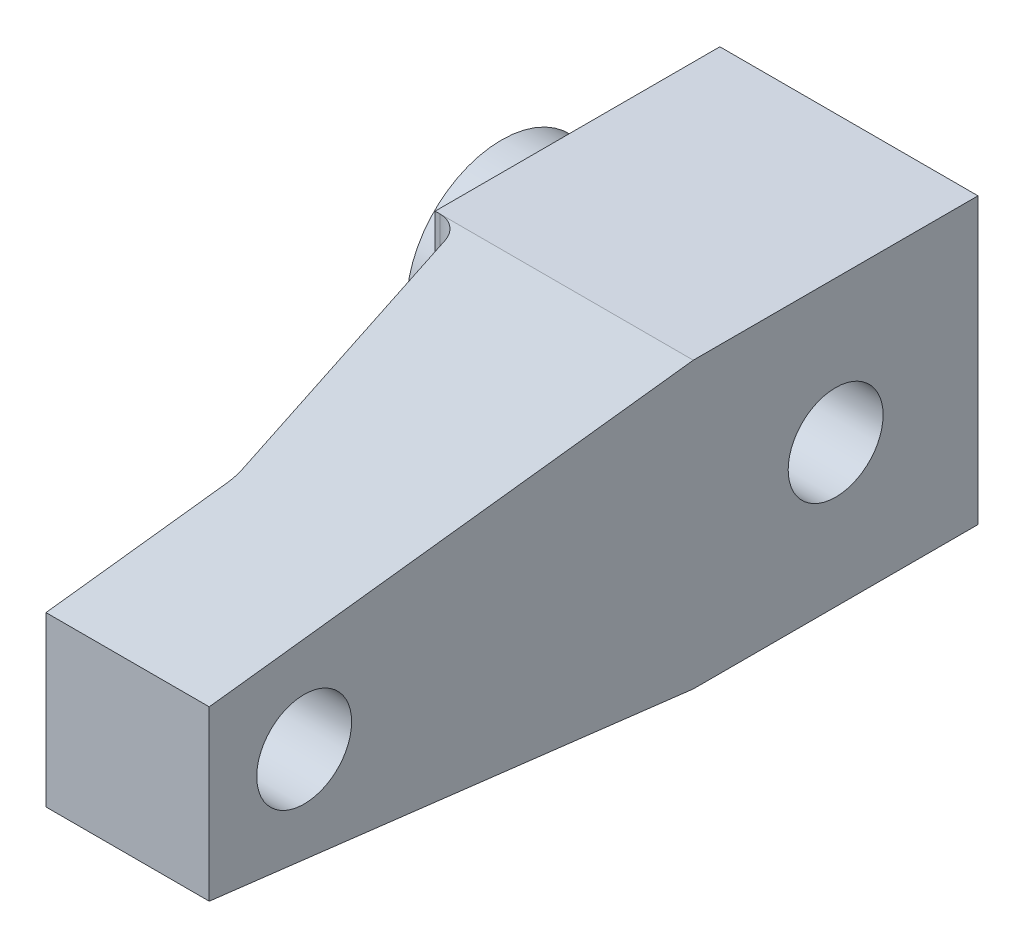
ISO-10303-21;
HEADER;
FILE_DESCRIPTION(('STEP AP214'),'2;1');
FILE_NAME('part.step','',(''),(''),'','','');
FILE_SCHEMA(('AUTOMOTIVE_DESIGN { 1 0 10303 214 1 1 1 1 }'));
ENDSEC;
DATA;
#1=APPLICATION_CONTEXT('core data for automotive mechanical design processes');
#2=APPLICATION_PROTOCOL_DEFINITION('international standard','automotive_design',2000,#1);
#3=PRODUCT_CONTEXT('',#1,'mechanical');
#4=PRODUCT('Part','Part','',(#3));
#5=PRODUCT_RELATED_PRODUCT_CATEGORY('part','',(#4));
#6=PRODUCT_DEFINITION_FORMATION('','',#4);
#7=PRODUCT_DEFINITION_CONTEXT('part definition',#1,'design');
#8=PRODUCT_DEFINITION('design','',#6,#7);
#9=PRODUCT_DEFINITION_SHAPE('','',#8);
#10=(LENGTH_UNIT() NAMED_UNIT(*) SI_UNIT(.MILLI.,.METRE.));
#11=(NAMED_UNIT(*) PLANE_ANGLE_UNIT() SI_UNIT($,.RADIAN.));
#12=(NAMED_UNIT(*) SI_UNIT($,.STERADIAN.) SOLID_ANGLE_UNIT());
#13=UNCERTAINTY_MEASURE_WITH_UNIT(LENGTH_MEASURE(1.E-05),#10,'distance_accuracy_value','');
#14=(GEOMETRIC_REPRESENTATION_CONTEXT(3) GLOBAL_UNCERTAINTY_ASSIGNED_CONTEXT((#13)) GLOBAL_UNIT_ASSIGNED_CONTEXT((#10,
#11,#12)) REPRESENTATION_CONTEXT('',''));
#15=CARTESIAN_POINT('',(0.,0.,0.));
#16=DIRECTION('',(0.,0.,1.));
#17=DIRECTION('',(1.,0.,0.));
#18=AXIS2_PLACEMENT_3D('',#15,#16,#17);
#19=CARTESIAN_POINT('',(0.,0.,0.));
#20=DIRECTION('',(-1.,0.,0.));
#21=DIRECTION('',(0.,0.,1.));
#22=AXIS2_PLACEMENT_3D('',#19,#20,#21);
#23=PLANE('',#22);
#24=DIRECTION('',(0.,1.,0.));
#25=VECTOR('',#24,1.);
#26=CARTESIAN_POINT('',(0.,-4.7625,4.7625));
#27=LINE('',#26,#25);
#28=CARTESIAN_POINT('',(0.,-4.7625,4.7625));
#29=VERTEX_POINT('',#28);
#30=CARTESIAN_POINT('',(0.,4.7625,4.7625));
#31=VERTEX_POINT('',#30);
#32=EDGE_CURVE('E170',#29,#31,#27,.T.);
#33=ORIENTED_EDGE('',*,*,#32,.T.);
#34=DIRECTION('',(0.,0.,1.));
#35=VECTOR('',#34,1.);
#36=CARTESIAN_POINT('',(0.,4.7625,-4.7625));
#37=LINE('',#36,#35);
#38=CARTESIAN_POINT('',(0.,4.7625,-4.7625));
#39=VERTEX_POINT('',#38);
#40=EDGE_CURVE('E119',#39,#31,#37,.T.);
#41=ORIENTED_EDGE('',*,*,#40,.F.);
#42=DIRECTION('',(0.,1.,0.));
#43=VECTOR('',#42,1.);
#44=CARTESIAN_POINT('',(0.,4.7625,-4.7625));
#45=LINE('',#44,#43);
#46=CARTESIAN_POINT('',(0.,-4.7625,-4.7625));
#47=VERTEX_POINT('',#46);
#48=EDGE_CURVE('E73',#47,#39,#45,.T.);
#49=ORIENTED_EDGE('',*,*,#48,.F.);
#50=DIRECTION('',(0.,0.,-1.));
#51=VECTOR('',#50,1.);
#52=CARTESIAN_POINT('',(0.,-4.7625,-4.7625));
#53=LINE('',#52,#51);
#54=EDGE_CURVE('E67',#29,#47,#53,.T.);
#55=ORIENTED_EDGE('',*,*,#54,.F.);
#56=EDGE_LOOP('',(#33,#41,#49,#55));
#57=FACE_BOUND('',#56,.T.);
#58=CARTESIAN_POINT('',(0.,0.,0.));
#59=DIRECTION('',(-1.,0.,0.));
#60=DIRECTION('',(0.,0.,1.));
#61=AXIS2_PLACEMENT_3D('',#58,#59,#60);
#62=CIRCLE('',#61,3.175);
#63=CARTESIAN_POINT('',(0.,0.,3.175));
#64=VERTEX_POINT('',#63);
#65=EDGE_CURVE('E230',#64,#64,#62,.T.);
#66=ORIENTED_EDGE('',*,*,#65,.F.);
#67=EDGE_LOOP('',(#66));
#68=FACE_BOUND('',#67,.T.);
#69=ADVANCED_FACE('F35',(#57,#68),#23,.T.);
#70=CARTESIAN_POINT('',(8.636,0.,0.));
#71=DIRECTION('',(-1.,0.,0.));
#72=DIRECTION('',(0.,0.,1.));
#73=AXIS2_PLACEMENT_3D('',#70,#71,#72);
#74=PLANE('',#73);
#75=DIRECTION('',(0.,0.,1.));
#76=VECTOR('',#75,1.);
#77=CARTESIAN_POINT('',(8.636,4.7625,-4.7625));
#78=LINE('',#77,#76);
#79=CARTESIAN_POINT('',(8.636,4.7625,-4.7625));
#80=VERTEX_POINT('',#79);
#81=CARTESIAN_POINT('',(8.636,4.7625,4.7625));
#82=VERTEX_POINT('',#81);
#83=EDGE_CURVE('E125',#80,#82,#78,.T.);
#84=ORIENTED_EDGE('',*,*,#83,.T.);
#85=DIRECTION('',(0.,-0.119336768534246,0.992853833993606));
#86=VECTOR('',#85,1.);
#87=CARTESIAN_POINT('',(8.636,4.7625,4.7625));
#88=LINE('',#87,#86);
#89=CARTESIAN_POINT('',(8.636,2.81623101424391,20.955));
#90=VERTEX_POINT('',#89);
#91=EDGE_CURVE('E82',#82,#90,#88,.T.);
#92=ORIENTED_EDGE('',*,*,#91,.T.);
#93=DIRECTION('',(0.,-1.,0.));
#94=VECTOR('',#93,1.);
#95=CARTESIAN_POINT('',(8.636,-2.81623101424391,20.955));
#96=LINE('',#95,#94);
#97=CARTESIAN_POINT('',(8.636,-2.81623101424391,20.955));
#98=VERTEX_POINT('',#97);
#99=EDGE_CURVE('E98',#90,#98,#96,.T.);
#100=ORIENTED_EDGE('',*,*,#99,.T.);
#101=DIRECTION('',(0.,-0.119336768534246,-0.992853833993606));
#102=VECTOR('',#101,1.);
#103=CARTESIAN_POINT('',(8.636,-4.7625,4.7625));
#104=LINE('',#103,#102);
#105=CARTESIAN_POINT('',(8.636,-4.7625,4.7625));
#106=VERTEX_POINT('',#105);
#107=EDGE_CURVE('E91',#98,#106,#104,.T.);
#108=ORIENTED_EDGE('',*,*,#107,.T.);
#109=DIRECTION('',(0.,0.,-1.));
#110=VECTOR('',#109,1.);
#111=CARTESIAN_POINT('',(8.636,-4.7625,-4.7625));
#112=LINE('',#111,#110);
#113=CARTESIAN_POINT('',(8.636,-4.7625,-4.7625));
#114=VERTEX_POINT('',#113);
#115=EDGE_CURVE('E96',#106,#114,#112,.T.);
#116=ORIENTED_EDGE('',*,*,#115,.T.);
#117=DIRECTION('',(0.,1.,0.));
#118=VECTOR('',#117,1.);
#119=CARTESIAN_POINT('',(8.636,4.7625,-4.7625));
#120=LINE('',#119,#118);
#121=EDGE_CURVE('E52',#114,#80,#120,.T.);
#122=ORIENTED_EDGE('',*,*,#121,.T.);
#123=EDGE_LOOP('',(#84,#92,#100,#108,#116,#122));
#124=FACE_BOUND('',#123,.T.);
#125=CARTESIAN_POINT('',(8.636,0.,0.));
#126=DIRECTION('',(1.,0.,0.));
#127=DIRECTION('',(0.,0.,-1.));
#128=AXIS2_PLACEMENT_3D('',#125,#126,#127);
#129=CIRCLE('',#128,1.5875);
#130=CARTESIAN_POINT('',(8.636,0.,-1.5875));
#131=VERTEX_POINT('',#130);
#132=EDGE_CURVE('E122',#131,#131,#129,.T.);
#133=ORIENTED_EDGE('',*,*,#132,.F.);
#134=EDGE_LOOP('',(#133));
#135=FACE_BOUND('',#134,.T.);
#136=CARTESIAN_POINT('',(8.636,0.,17.78));
#137=DIRECTION('',(1.,0.,0.));
#138=DIRECTION('',(0.,0.,-1.));
#139=AXIS2_PLACEMENT_3D('',#136,#137,#138);
#140=CIRCLE('',#139,1.5875);
#141=CARTESIAN_POINT('',(8.636,0.,16.1925));
#142=VERTEX_POINT('',#141);
#143=EDGE_CURVE('E191',#142,#142,#140,.T.);
#144=ORIENTED_EDGE('',*,*,#143,.F.);
#145=EDGE_LOOP('',(#144));
#146=FACE_BOUND('',#145,.T.);
#147=ADVANCED_FACE('F93',(#124,#135,#146),#74,.F.);
#148=CARTESIAN_POINT('',(8.636,4.7625,-4.7625));
#149=DIRECTION('',(0.,-1.,0.));
#150=DIRECTION('',(0.,0.,-1.));
#151=AXIS2_PLACEMENT_3D('',#148,#149,#150);
#152=PLANE('',#151);
#153=ORIENTED_EDGE('',*,*,#40,.T.);
#154=DIRECTION('',(-1.,0.,0.));
#155=VECTOR('',#154,1.);
#156=CARTESIAN_POINT('',(0.,4.7625,4.7625));
#157=LINE('',#156,#155);
#158=CARTESIAN_POINT('',(0.169136426977912,4.7625,4.7625));
#159=VERTEX_POINT('',#158);
#160=EDGE_CURVE('E223',#159,#31,#157,.T.);
#161=ORIENTED_EDGE('',*,*,#160,.F.);
#162=DIRECTION('',(-1.,0.,0.));
#163=VECTOR('',#162,1.);
#164=CARTESIAN_POINT('',(8.636,4.7625,4.7625));
#165=LINE('',#164,#163);
#166=EDGE_CURVE('E132',#82,#159,#165,.T.);
#167=ORIENTED_EDGE('',*,*,#166,.F.);
#168=ORIENTED_EDGE('',*,*,#83,.F.);
#169=DIRECTION('',(-1.,0.,0.));
#170=VECTOR('',#169,1.);
#171=CARTESIAN_POINT('',(8.636,4.7625,-4.7625));
#172=LINE('',#171,#170);
#173=EDGE_CURVE('E115',#80,#39,#172,.T.);
#174=ORIENTED_EDGE('',*,*,#173,.T.);
#175=EDGE_LOOP('',(#153,#161,#167,#168,#174));
#176=FACE_BOUND('',#175,.T.);
#177=ADVANCED_FACE('F37',(#176),#152,.F.);
#178=CARTESIAN_POINT('',(8.636,4.7625,4.7625));
#179=DIRECTION('',(0.,-0.992853833993606,-0.119336768534246));
#180=DIRECTION('',(0.,0.119336768534246,-0.992853833993606));
#181=AXIS2_PLACEMENT_3D('',#178,#179,#180);
#182=PLANE('',#181);
#183=ORIENTED_EDGE('',*,*,#166,.T.);
#184=CARTESIAN_POINT('',(0.169136426977917,4.66709465756098,5.55625));
#185=DIRECTION('',(0.,-0.992853833993606,-0.119336768534246));
#186=DIRECTION('',(0.,0.119336768534246,-0.992853833993606));
#187=AXIS2_PLACEMENT_3D('',#184,#185,#186);
#188=ELLIPSE('',#187,0.799463096000002,0.79375);
#189=CARTESIAN_POINT('',(0.940628703875654,4.68952934941767,5.36959864268604));
#190=VERTEX_POINT('',#189);
#191=EDGE_CURVE('E183',#159,#190,#188,.T.);
#192=ORIENTED_EDGE('',*,*,#191,.T.);
#193=DIRECTION('',(0.233562867927725,-0.11603611670614,0.965393187434599));
#194=VECTOR('',#193,1.);
#195=CARTESIAN_POINT('',(1.22155738920292,4.54996147201506,6.53077054203874));
#196=LINE('',#195,#194);
#197=CARTESIAN_POINT('',(3.10377528607275,3.61485882712393,14.3106045157674));
#198=VERTEX_POINT('',#197);
#199=EDGE_CURVE('E188',#190,#198,#196,.T.);
#200=ORIENTED_EDGE('',*,*,#199,.T.);
#201=CARTESIAN_POINT('',(0.634999999999999,3.54306781318252,14.9078888591721));
#202=DIRECTION('',(0.,-0.992853833993606,-0.119336768534246));
#203=DIRECTION('',(0.,0.119336768534246,-0.992853833993606));
#204=AXIS2_PLACEMENT_3D('',#201,#202,#203);
#205=ELLIPSE('',#204,2.5582819072,2.54);
#206=CARTESIAN_POINT('',(3.175,3.54306781318252,14.9078888591721));
#207=VERTEX_POINT('',#206);
#208=EDGE_CURVE('E186',#198,#207,#205,.T.);
#209=ORIENTED_EDGE('',*,*,#208,.T.);
#210=DIRECTION('',(0.,-0.119336768534246,0.992853833993606));
#211=VECTOR('',#210,1.);
#212=CARTESIAN_POINT('',(3.175,4.7625,4.7625));
#213=LINE('',#212,#211);
#214=CARTESIAN_POINT('',(3.175,2.81623101424391,20.955));
#215=VERTEX_POINT('',#214);
#216=EDGE_CURVE('E166',#207,#215,#213,.T.);
#217=ORIENTED_EDGE('',*,*,#216,.T.);
#218=DIRECTION('',(-1.,0.,0.));
#219=VECTOR('',#218,1.);
#220=CARTESIAN_POINT('',(8.636,2.81623101424391,20.955));
#221=LINE('',#220,#219);
#222=EDGE_CURVE('E129',#90,#215,#221,.T.);
#223=ORIENTED_EDGE('',*,*,#222,.F.);
#224=ORIENTED_EDGE('',*,*,#91,.F.);
#225=EDGE_LOOP('',(#183,#192,#200,#209,#217,#223,#224));
#226=FACE_BOUND('',#225,.T.);
#227=ADVANCED_FACE('F199',(#226),#182,.F.);
#228=CARTESIAN_POINT('',(8.636,-2.81623101424391,20.955));
#229=DIRECTION('',(0.,0.,-1.));
#230=DIRECTION('',(0.,1.,0.));
#231=AXIS2_PLACEMENT_3D('',#228,#229,#230);
#232=PLANE('',#231);
#233=ORIENTED_EDGE('',*,*,#222,.T.);
#234=DIRECTION('',(0.,1.,0.));
#235=VECTOR('',#234,1.);
#236=CARTESIAN_POINT('',(3.175,-4.7625,20.955));
#237=LINE('',#236,#235);
#238=CARTESIAN_POINT('',(3.175,-2.81623101424391,20.955));
#239=VERTEX_POINT('',#238);
#240=EDGE_CURVE('E167',#239,#215,#237,.T.);
#241=ORIENTED_EDGE('',*,*,#240,.F.);
#242=DIRECTION('',(-1.,0.,0.));
#243=VECTOR('',#242,1.);
#244=CARTESIAN_POINT('',(8.636,-2.81623101424391,20.955));
#245=LINE('',#244,#243);
#246=EDGE_CURVE('E110',#98,#239,#245,.T.);
#247=ORIENTED_EDGE('',*,*,#246,.F.);
#248=ORIENTED_EDGE('',*,*,#99,.F.);
#249=EDGE_LOOP('',(#233,#241,#247,#248));
#250=FACE_BOUND('',#249,.T.);
#251=ADVANCED_FACE('F202',(#250),#232,.F.);
#252=CARTESIAN_POINT('',(8.636,-4.7625,4.7625));
#253=DIRECTION('',(0.,0.992853833993606,-0.119336768534246));
#254=DIRECTION('',(0.,0.119336768534246,0.992853833993606));
#255=AXIS2_PLACEMENT_3D('',#252,#253,#254);
#256=PLANE('',#255);
#257=DIRECTION('',(-0.233562867927725,-0.11603611670614,-0.965393187434599));
#258=VECTOR('',#257,1.);
#259=CARTESIAN_POINT('',(1.22155738920292,-4.54996147201506,6.53077054203874));
#260=LINE('',#259,#258);
#261=CARTESIAN_POINT('',(3.10377528607275,-3.61485882712393,14.3106045157674));
#262=VERTEX_POINT('',#261);
#263=CARTESIAN_POINT('',(0.940628703875654,-4.68952934941767,5.36959864268604));
#264=VERTEX_POINT('',#263);
#265=EDGE_CURVE('E11',#262,#264,#260,.T.);
#266=ORIENTED_EDGE('',*,*,#265,.T.);
#267=CARTESIAN_POINT('',(0.169136426977917,-4.66709465756098,5.55625));
#268=DIRECTION('',(0.,0.992853833993606,-0.119336768534246));
#269=DIRECTION('',(0.,0.119336768534246,0.992853833993606));
#270=AXIS2_PLACEMENT_3D('',#267,#268,#269);
#271=ELLIPSE('',#270,0.799463096000002,0.79375);
#272=CARTESIAN_POINT('',(0.169136426977912,-4.7625,4.7625));
#273=VERTEX_POINT('',#272);
#274=EDGE_CURVE('E109',#264,#273,#271,.T.);
#275=ORIENTED_EDGE('',*,*,#274,.T.);
#276=DIRECTION('',(-1.,0.,0.));
#277=VECTOR('',#276,1.);
#278=CARTESIAN_POINT('',(8.636,-4.7625,4.7625));
#279=LINE('',#278,#277);
#280=EDGE_CURVE('E105',#106,#273,#279,.T.);
#281=ORIENTED_EDGE('',*,*,#280,.F.);
#282=ORIENTED_EDGE('',*,*,#107,.F.);
#283=ORIENTED_EDGE('',*,*,#246,.T.);
#284=DIRECTION('',(0.,-0.119336768534246,-0.992853833993606));
#285=VECTOR('',#284,1.);
#286=CARTESIAN_POINT('',(3.175,-4.7625,4.7625));
#287=LINE('',#286,#285);
#288=CARTESIAN_POINT('',(3.175,-3.54306781318252,14.9078888591721));
#289=VERTEX_POINT('',#288);
#290=EDGE_CURVE('E136',#239,#289,#287,.T.);
#291=ORIENTED_EDGE('',*,*,#290,.T.);
#292=CARTESIAN_POINT('',(0.634999999999999,-3.54306781318252,14.9078888591721));
#293=DIRECTION('',(0.,0.992853833993606,-0.119336768534246));
#294=DIRECTION('',(0.,0.119336768534246,0.992853833993606));
#295=AXIS2_PLACEMENT_3D('',#292,#293,#294);
#296=ELLIPSE('',#295,2.5582819072,2.54);
#297=EDGE_CURVE('E44',#289,#262,#296,.T.);
#298=ORIENTED_EDGE('',*,*,#297,.T.);
#299=EDGE_LOOP('',(#266,#275,#281,#282,#283,#291,#298));
#300=FACE_BOUND('',#299,.T.);
#301=ADVANCED_FACE('F106',(#300),#256,.F.);
#302=CARTESIAN_POINT('',(8.636,-4.7625,-4.7625));
#303=DIRECTION('',(0.,1.,0.));
#304=DIRECTION('',(0.,0.,1.));
#305=AXIS2_PLACEMENT_3D('',#302,#303,#304);
#306=PLANE('',#305);
#307=ORIENTED_EDGE('',*,*,#54,.T.);
#308=DIRECTION('',(-1.,0.,0.));
#309=VECTOR('',#308,1.);
#310=CARTESIAN_POINT('',(8.636,-4.7625,-4.7625));
#311=LINE('',#310,#309);
#312=EDGE_CURVE('E111',#114,#47,#311,.T.);
#313=ORIENTED_EDGE('',*,*,#312,.F.);
#314=ORIENTED_EDGE('',*,*,#115,.F.);
#315=ORIENTED_EDGE('',*,*,#280,.T.);
#316=DIRECTION('',(-1.,0.,0.));
#317=VECTOR('',#316,1.);
#318=CARTESIAN_POINT('',(0.,-4.7625,4.7625));
#319=LINE('',#318,#317);
#320=EDGE_CURVE('E179',#273,#29,#319,.T.);
#321=ORIENTED_EDGE('',*,*,#320,.T.);
#322=EDGE_LOOP('',(#307,#313,#314,#315,#321));
#323=FACE_BOUND('',#322,.T.);
#324=ADVANCED_FACE('F113',(#323),#306,.F.);
#325=CARTESIAN_POINT('',(8.636,4.7625,-4.7625));
#326=DIRECTION('',(0.,0.,1.));
#327=DIRECTION('',(1.,0.,0.));
#328=AXIS2_PLACEMENT_3D('',#325,#326,#327);
#329=PLANE('',#328);
#330=ORIENTED_EDGE('',*,*,#48,.T.);
#331=ORIENTED_EDGE('',*,*,#173,.F.);
#332=ORIENTED_EDGE('',*,*,#121,.F.);
#333=ORIENTED_EDGE('',*,*,#312,.T.);
#334=EDGE_LOOP('',(#330,#331,#332,#333));
#335=FACE_BOUND('',#334,.T.);
#336=ADVANCED_FACE('F264',(#335),#329,.F.);
#337=CARTESIAN_POINT('',(8.636,0.,0.));
#338=DIRECTION('',(-1.,0.,0.));
#339=DIRECTION('',(0.,0.,1.));
#340=AXIS2_PLACEMENT_3D('',#337,#338,#339);
#341=CYLINDRICAL_SURFACE('',#340,1.5875);
#342=ORIENTED_EDGE('',*,*,#132,.T.);
#343=EDGE_LOOP('',(#342));
#344=FACE_BOUND('',#343,.T.);
#345=CARTESIAN_POINT('',(-2.54,0.,0.));
#346=DIRECTION('',(-1.,0.,0.));
#347=DIRECTION('',(0.,0.,1.));
#348=AXIS2_PLACEMENT_3D('',#345,#346,#347);
#349=CIRCLE('',#348,1.5875);
#350=CARTESIAN_POINT('',(-2.54,0.,1.5875));
#351=VERTEX_POINT('',#350);
#352=EDGE_CURVE('E234',#351,#351,#349,.T.);
#353=ORIENTED_EDGE('',*,*,#352,.T.);
#354=EDGE_LOOP('',(#353));
#355=FACE_BOUND('',#354,.T.);
#356=ADVANCED_FACE('F239',(#344,#355),#341,.F.);
#357=CARTESIAN_POINT('',(8.636,0.,17.78));
#358=DIRECTION('',(-1.,0.,0.));
#359=DIRECTION('',(0.,0.,1.));
#360=AXIS2_PLACEMENT_3D('',#357,#358,#359);
#361=CYLINDRICAL_SURFACE('',#360,1.5875);
#362=CARTESIAN_POINT('',(3.175,0.,17.78));
#363=DIRECTION('',(1.,0.,0.));
#364=DIRECTION('',(0.,0.,-1.));
#365=AXIS2_PLACEMENT_3D('',#362,#363,#364);
#366=CIRCLE('',#365,1.5875);
#367=CARTESIAN_POINT('',(3.175,0.,16.1925));
#368=VERTEX_POINT('',#367);
#369=EDGE_CURVE('E134',#368,#368,#366,.T.);
#370=ORIENTED_EDGE('',*,*,#369,.F.);
#371=EDGE_LOOP('',(#370));
#372=FACE_BOUND('',#371,.T.);
#373=ORIENTED_EDGE('',*,*,#143,.T.);
#374=EDGE_LOOP('',(#373));
#375=FACE_BOUND('',#374,.T.);
#376=ADVANCED_FACE('F300',(#372,#375),#361,.F.);
#377=CARTESIAN_POINT('',(0.940628703875654,-4.7625,5.36959864268604));
#378=DIRECTION('',(0.971958774044392,0.,-0.235151316301062));
#379=DIRECTION('',(-0.235151316301062,0.,-0.971958774044392));
#380=AXIS2_PLACEMENT_3D('',#377,#378,#379);
#381=PLANE('',#380);
#382=DIRECTION('',(0.,1.,0.));
#383=VECTOR('',#382,1.);
#384=CARTESIAN_POINT('',(0.940628703875654,-4.7625,5.36959864268604));
#385=LINE('',#384,#383);
#386=EDGE_CURVE('E137',#264,#190,#385,.T.);
#387=ORIENTED_EDGE('',*,*,#386,.F.);
#388=ORIENTED_EDGE('',*,*,#265,.F.);
#389=DIRECTION('',(0.,1.,0.));
#390=VECTOR('',#389,1.);
#391=CARTESIAN_POINT('',(3.10377528607275,-4.7625,14.3106045157674));
#392=LINE('',#391,#390);
#393=EDGE_CURVE('E157',#262,#198,#392,.T.);
#394=ORIENTED_EDGE('',*,*,#393,.T.);
#395=ORIENTED_EDGE('',*,*,#199,.F.);
#396=EDGE_LOOP('',(#387,#388,#394,#395));
#397=FACE_BOUND('',#396,.T.);
#398=ADVANCED_FACE('F212',(#397),#381,.F.);
#399=CARTESIAN_POINT('',(0.634999999999999,-4.7625,14.9078888591721));
#400=DIRECTION('',(0.,1.,0.));
#401=DIRECTION('',(0.,0.,1.));
#402=AXIS2_PLACEMENT_3D('',#399,#400,#401);
#403=CYLINDRICAL_SURFACE('',#402,2.54);
#404=ORIENTED_EDGE('',*,*,#393,.F.);
#405=ORIENTED_EDGE('',*,*,#297,.F.);
#406=DIRECTION('',(0.,1.,0.));
#407=VECTOR('',#406,1.);
#408=CARTESIAN_POINT('',(3.175,-4.7625,14.9078888591721));
#409=LINE('',#408,#407);
#410=EDGE_CURVE('E154',#289,#207,#409,.T.);
#411=ORIENTED_EDGE('',*,*,#410,.T.);
#412=ORIENTED_EDGE('',*,*,#208,.F.);
#413=EDGE_LOOP('',(#404,#405,#411,#412));
#414=FACE_BOUND('',#413,.T.);
#415=ADVANCED_FACE('F151',(#414),#403,.F.);
#416=CARTESIAN_POINT('',(0.169136426977917,-4.7625,5.55625));
#417=DIRECTION('',(0.,1.,0.));
#418=DIRECTION('',(0.,0.,1.));
#419=AXIS2_PLACEMENT_3D('',#416,#417,#418);
#420=CYLINDRICAL_SURFACE('',#419,0.79375);
#421=DIRECTION('',(0.,1.,0.));
#422=VECTOR('',#421,1.);
#423=CARTESIAN_POINT('',(0.169136426977912,-4.7625,4.7625));
#424=LINE('',#423,#422);
#425=EDGE_CURVE('E176',#273,#159,#424,.T.);
#426=ORIENTED_EDGE('',*,*,#425,.F.);
#427=ORIENTED_EDGE('',*,*,#274,.F.);
#428=ORIENTED_EDGE('',*,*,#386,.T.);
#429=ORIENTED_EDGE('',*,*,#191,.F.);
#430=EDGE_LOOP('',(#426,#427,#428,#429));
#431=FACE_BOUND('',#430,.T.);
#432=ADVANCED_FACE('F216',(#431),#420,.F.);
#433=CARTESIAN_POINT('',(3.175,-4.7625,14.9078888591721));
#434=DIRECTION('',(1.,0.,0.));
#435=DIRECTION('',(0.,0.,-1.));
#436=AXIS2_PLACEMENT_3D('',#433,#434,#435);
#437=PLANE('',#436);
#438=ORIENTED_EDGE('',*,*,#369,.T.);
#439=EDGE_LOOP('',(#438));
#440=FACE_BOUND('',#439,.T.);
#441=ORIENTED_EDGE('',*,*,#410,.F.);
#442=ORIENTED_EDGE('',*,*,#290,.F.);
#443=ORIENTED_EDGE('',*,*,#240,.T.);
#444=ORIENTED_EDGE('',*,*,#216,.F.);
#445=EDGE_LOOP('',(#441,#442,#443,#444));
#446=FACE_BOUND('',#445,.T.);
#447=ADVANCED_FACE('F161',(#440,#446),#437,.F.);
#448=CARTESIAN_POINT('',(0.,-4.7625,4.7625));
#449=DIRECTION('',(0.,0.,-1.));
#450=DIRECTION('',(-1.,0.,0.));
#451=AXIS2_PLACEMENT_3D('',#448,#449,#450);
#452=PLANE('',#451);
#453=ORIENTED_EDGE('',*,*,#32,.F.);
#454=ORIENTED_EDGE('',*,*,#320,.F.);
#455=ORIENTED_EDGE('',*,*,#425,.T.);
#456=ORIENTED_EDGE('',*,*,#160,.T.);
#457=EDGE_LOOP('',(#453,#454,#455,#456));
#458=FACE_BOUND('',#457,.T.);
#459=ADVANCED_FACE('F244',(#458),#452,.F.);
#460=CARTESIAN_POINT('',(-2.54,0.,0.));
#461=DIRECTION('',(-1.,0.,0.));
#462=DIRECTION('',(0.,0.,1.));
#463=AXIS2_PLACEMENT_3D('',#460,#461,#462);
#464=PLANE('',#463);
#465=CARTESIAN_POINT('',(-2.54,0.,0.));
#466=DIRECTION('',(-1.,0.,0.));
#467=DIRECTION('',(0.,0.,1.));
#468=AXIS2_PLACEMENT_3D('',#465,#466,#467);
#469=CIRCLE('',#468,3.175);
#470=CARTESIAN_POINT('',(-2.54,0.,3.175));
#471=VERTEX_POINT('',#470);
#472=EDGE_CURVE('E226',#471,#471,#469,.T.);
#473=ORIENTED_EDGE('',*,*,#472,.T.);
#474=EDGE_LOOP('',(#473));
#475=FACE_BOUND('',#474,.T.);
#476=ORIENTED_EDGE('',*,*,#352,.F.);
#477=EDGE_LOOP('',(#476));
#478=FACE_BOUND('',#477,.T.);
#479=ADVANCED_FACE('F241',(#475,#478),#464,.T.);
#480=CARTESIAN_POINT('',(-2.54,0.,0.));
#481=DIRECTION('',(1.,0.,0.));
#482=DIRECTION('',(0.,0.,-1.));
#483=AXIS2_PLACEMENT_3D('',#480,#481,#482);
#484=CYLINDRICAL_SURFACE('',#483,3.175);
#485=ORIENTED_EDGE('',*,*,#472,.F.);
#486=EDGE_LOOP('',(#485));
#487=FACE_BOUND('',#486,.T.);
#488=ORIENTED_EDGE('',*,*,#65,.T.);
#489=EDGE_LOOP('',(#488));
#490=FACE_BOUND('',#489,.T.);
#491=ADVANCED_FACE('F243',(#487,#490),#484,.T.);
#492=CLOSED_SHELL('',(#69,#147,#177,#227,#251,#301,#324,#336,#356,#376,#398,#415,#432,#447,#459,
#479,#491));
#493=MANIFOLD_SOLID_BREP('B2',#492);
#494=ADVANCED_BREP_SHAPE_REPRESENTATION('',(#18,#493),#14);
#495=SHAPE_DEFINITION_REPRESENTATION(#9,#494);
ENDSEC;
END-ISO-10303-21;
